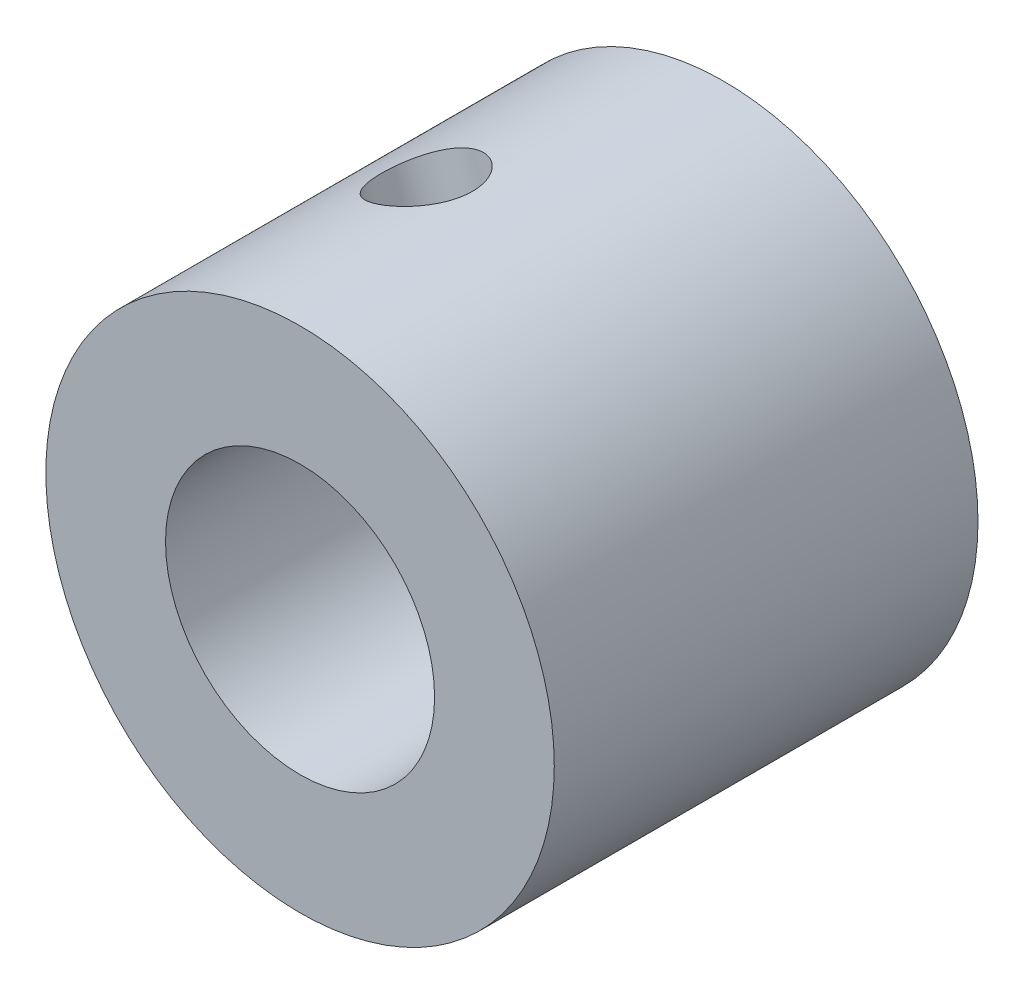
ISO-10303-21;
HEADER;
FILE_DESCRIPTION(('STEP AP214'),'2;1');
FILE_NAME('part.step','',(''),(''),'','','');
FILE_SCHEMA(('AUTOMOTIVE_DESIGN { 1 0 10303 214 1 1 1 1 }'));
ENDSEC;
DATA;
#1=APPLICATION_CONTEXT('core data for automotive mechanical design processes');
#2=APPLICATION_PROTOCOL_DEFINITION('international standard','automotive_design',2000,#1);
#3=PRODUCT_CONTEXT('',#1,'mechanical');
#4=PRODUCT('Part','Part','',(#3));
#5=PRODUCT_RELATED_PRODUCT_CATEGORY('part','',(#4));
#6=PRODUCT_DEFINITION_FORMATION('','',#4);
#7=PRODUCT_DEFINITION_CONTEXT('part definition',#1,'design');
#8=PRODUCT_DEFINITION('design','',#6,#7);
#9=PRODUCT_DEFINITION_SHAPE('','',#8);
#10=(LENGTH_UNIT() NAMED_UNIT(*) SI_UNIT(.MILLI.,.METRE.));
#11=(NAMED_UNIT(*) PLANE_ANGLE_UNIT() SI_UNIT($,.RADIAN.));
#12=(NAMED_UNIT(*) SI_UNIT($,.STERADIAN.) SOLID_ANGLE_UNIT());
#13=UNCERTAINTY_MEASURE_WITH_UNIT(LENGTH_MEASURE(1.E-05),#10,'distance_accuracy_value','');
#14=(GEOMETRIC_REPRESENTATION_CONTEXT(3) GLOBAL_UNCERTAINTY_ASSIGNED_CONTEXT((#13)) GLOBAL_UNIT_ASSIGNED_CONTEXT((#10,
#11,#12)) REPRESENTATION_CONTEXT('',''));
#15=CARTESIAN_POINT('',(0.,0.,0.));
#16=DIRECTION('',(0.,0.,1.));
#17=DIRECTION('',(1.,0.,0.));
#18=AXIS2_PLACEMENT_3D('',#15,#16,#17);
#19=CARTESIAN_POINT('',(0.,0.,10.));
#20=DIRECTION('',(0.,0.,1.));
#21=DIRECTION('',(1.,0.,0.));
#22=AXIS2_PLACEMENT_3D('',#19,#20,#21);
#23=PLANE('',#22);
#24=CARTESIAN_POINT('',(0.,0.,10.));
#25=DIRECTION('',(0.,0.,1.));
#26=DIRECTION('',(1.,0.,0.));
#27=AXIS2_PLACEMENT_3D('',#24,#25,#26);
#28=CIRCLE('',#27,6.);
#29=CARTESIAN_POINT('',(6.,0.,10.));
#30=VERTEX_POINT('',#29);
#31=EDGE_CURVE('E47',#30,#30,#28,.T.);
#32=ORIENTED_EDGE('',*,*,#31,.T.);
#33=EDGE_LOOP('',(#32));
#34=FACE_BOUND('',#33,.T.);
#35=CARTESIAN_POINT('',(0.,0.,10.));
#36=DIRECTION('',(0.,0.,1.));
#37=DIRECTION('',(1.,0.,0.));
#38=AXIS2_PLACEMENT_3D('',#35,#36,#37);
#39=CIRCLE('',#38,3.175);
#40=CARTESIAN_POINT('',(3.175,0.,10.));
#41=VERTEX_POINT('',#40);
#42=EDGE_CURVE('E56',#41,#41,#39,.T.);
#43=ORIENTED_EDGE('',*,*,#42,.F.);
#44=EDGE_LOOP('',(#43));
#45=FACE_BOUND('',#44,.T.);
#46=ADVANCED_FACE('F36',(#34,#45),#23,.T.);
#47=CARTESIAN_POINT('',(0.,0.,0.));
#48=DIRECTION('',(0.,0.,1.));
#49=DIRECTION('',(1.,0.,0.));
#50=AXIS2_PLACEMENT_3D('',#47,#48,#49);
#51=PLANE('',#50);
#52=CARTESIAN_POINT('',(0.,0.,0.));
#53=DIRECTION('',(0.,0.,1.));
#54=DIRECTION('',(1.,0.,0.));
#55=AXIS2_PLACEMENT_3D('',#52,#53,#54);
#56=CIRCLE('',#55,6.);
#57=CARTESIAN_POINT('',(6.,0.,0.));
#58=VERTEX_POINT('',#57);
#59=EDGE_CURVE('E51',#58,#58,#56,.T.);
#60=ORIENTED_EDGE('',*,*,#59,.F.);
#61=EDGE_LOOP('',(#60));
#62=FACE_BOUND('',#61,.T.);
#63=CARTESIAN_POINT('',(0.,0.,0.));
#64=DIRECTION('',(0.,0.,1.));
#65=DIRECTION('',(1.,0.,0.));
#66=AXIS2_PLACEMENT_3D('',#63,#64,#65);
#67=CIRCLE('',#66,3.175);
#68=CARTESIAN_POINT('',(3.175,0.,0.));
#69=VERTEX_POINT('',#68);
#70=EDGE_CURVE('E58',#69,#69,#67,.T.);
#71=ORIENTED_EDGE('',*,*,#70,.T.);
#72=EDGE_LOOP('',(#71));
#73=FACE_BOUND('',#72,.T.);
#74=ADVANCED_FACE('F82',(#62,#73),#51,.F.);
#75=CARTESIAN_POINT('',(0.,0.,10.));
#76=DIRECTION('',(0.,0.,-1.));
#77=DIRECTION('',(-1.,0.,0.));
#78=AXIS2_PLACEMENT_3D('',#75,#76,#77);
#79=CYLINDRICAL_SURFACE('',#78,6.);
#80=CARTESIAN_POINT('',(-2.90937930885415,5.24742908834521,5.17004521619187));
#81=CARTESIAN_POINT('',(-2.90937740223212,5.24743099708408,5.10716313939418));
#82=CARTESIAN_POINT('',(-2.90469282606548,5.25003589824677,5.04424990720161));
#83=CARTESIAN_POINT('',(-2.88606456780618,5.2602984845414,4.92019784248082));
#84=CARTESIAN_POINT('',(-2.87211306179035,5.2679604392295,4.85906055491759));
#85=CARTESIAN_POINT('',(-2.83531684969267,5.28785520007973,4.74037324169944));
#86=CARTESIAN_POINT('',(-2.81248046616209,5.30008372825862,4.68281991726653));
#87=CARTESIAN_POINT('',(-2.7584671716293,5.32839416926601,4.57281324494172));
#88=CARTESIAN_POINT('',(-2.72729089866323,5.34447578730733,4.52035950732863));
#89=CARTESIAN_POINT('',(-2.65692021024631,5.3798083767979,4.42137823572656));
#90=CARTESIAN_POINT('',(-2.61763948115923,5.39909298935484,4.37492406390095));
#91=CARTESIAN_POINT('',(-2.53219098909114,5.43969135803022,4.28989986023983));
#92=CARTESIAN_POINT('',(-2.4860227722531,5.46100524783614,4.25133034836821));
#93=CARTESIAN_POINT('',(-2.38751446673446,5.50478860764355,4.18288894930693));
#94=CARTESIAN_POINT('',(-2.33512962274242,5.52726570724702,4.15308626823184));
#95=CARTESIAN_POINT('',(-2.22581104738116,5.5721856397903,4.10347044162291));
#96=CARTESIAN_POINT('',(-2.16887769399804,5.59462847541984,4.08365646701486));
#97=CARTESIAN_POINT('',(-2.05269516747164,5.63828402086555,4.054807456249));
#98=CARTESIAN_POINT('',(-1.993480983613,5.65950807036627,4.0456487345637));
#99=CARTESIAN_POINT('',(-1.87379354993467,5.70025370893503,4.03798479160885));
#100=CARTESIAN_POINT('',(-1.81332040874296,5.71977544413771,4.03947865495836));
#101=CARTESIAN_POINT('',(-1.69365054830205,5.75633693249849,4.05298269057115));
#102=CARTESIAN_POINT('',(-1.63444735726852,5.7734049422337,4.06485968047972));
#103=CARTESIAN_POINT('',(-1.51825605851861,5.80504319094556,4.09858214434878));
#104=CARTESIAN_POINT('',(-1.46126803217375,5.81961333823303,4.12042798412862));
#105=CARTESIAN_POINT('',(-1.35084726107495,5.84623458294966,4.17359468148321));
#106=CARTESIAN_POINT('',(-1.297436573094,5.85827088664806,4.20496870549215));
#107=CARTESIAN_POINT('',(-1.1960842114209,5.87980195769522,4.2762619912473));
#108=CARTESIAN_POINT('',(-1.1481430997281,5.88929646400882,4.3161821298974));
#109=CARTESIAN_POINT('',(-1.05845879506584,5.90608011718007,4.40416813747097));
#110=CARTESIAN_POINT('',(-1.01682302206378,5.91333285379279,4.45235052546055));
#111=CARTESIAN_POINT('',(-0.941967114938653,5.92571867923697,4.55510535787081));
#112=CARTESIAN_POINT('',(-0.908747106272158,5.93085173647039,4.60967789753383));
#113=CARTESIAN_POINT('',(-0.851778526778022,5.93930199093268,4.72381515957614));
#114=CARTESIAN_POINT('',(-0.828046405404513,5.94261603816224,4.78338833728392));
#115=CARTESIAN_POINT('',(-0.790983046757102,5.9476633379282,4.90574949054541));
#116=CARTESIAN_POINT('',(-0.777650618951003,5.94939677141335,4.96853709724174));
#117=CARTESIAN_POINT('',(-0.762001183525699,5.95142136508584,5.09452170471922));
#118=CARTESIAN_POINT('',(-0.759519699099542,5.95173406341029,5.15769794943522));
#119=CARTESIAN_POINT('',(-0.765214190876867,5.95100455325656,5.28355770356006));
#120=CARTESIAN_POINT('',(-0.77338963476434,5.9499624124529,5.34624123742258));
#121=CARTESIAN_POINT('',(-0.799983122348805,5.94644453364008,5.46879949870044));
#122=CARTESIAN_POINT('',(-0.818315068615444,5.94398083906723,5.52869330948714));
#123=CARTESIAN_POINT('',(-0.864522302716196,5.93743567522528,5.64458347289417));
#124=CARTESIAN_POINT('',(-0.892398299691919,5.93335408573987,5.70057953553206));
#125=CARTESIAN_POINT('',(-0.957154127839459,5.92325402403024,5.80780245329278));
#126=CARTESIAN_POINT('',(-0.994135038010752,5.91721354819956,5.85896617068206));
#127=CARTESIAN_POINT('',(-1.07575824772212,5.90291935234871,5.954413903892));
#128=CARTESIAN_POINT('',(-1.12040124290962,5.89466543132959,5.9986972943456));
#129=CARTESIAN_POINT('',(-1.21664511522656,5.87556033652041,6.07973693215948));
#130=CARTESIAN_POINT('',(-1.2683317745134,5.8646756094868,6.1163835122474));
#131=CARTESIAN_POINT('',(-1.37661450587918,5.84020624277289,6.18033501304486));
#132=CARTESIAN_POINT('',(-1.43321038759574,5.82662170775529,6.20764029577423));
#133=CARTESIAN_POINT('',(-1.54928725018275,5.79683337132111,6.25197023352538));
#134=CARTESIAN_POINT('',(-1.60875135726321,5.78064382804465,6.26904858875984));
#135=CARTESIAN_POINT('',(-1.72904220579137,5.74580983869063,6.29261117356725));
#136=CARTESIAN_POINT('',(-1.78986880174824,5.72716565370008,6.29909652887838));
#137=CARTESIAN_POINT('',(-1.91012534277765,5.68817684067372,6.30124952190395));
#138=CARTESIAN_POINT('',(-1.96956234673546,5.66786293447405,6.29708274331441));
#139=CARTESIAN_POINT('',(-2.08631375635869,5.62593487832967,6.27841260639274));
#140=CARTESIAN_POINT('',(-2.143628182783,5.60432074110668,6.26390934917979));
#141=CARTESIAN_POINT('',(-2.25449361856928,5.56064789388123,6.22504798978098));
#142=CARTESIAN_POINT('',(-2.30805121503208,5.53859005394114,6.2007076695435));
#143=CARTESIAN_POINT('',(-2.41017737966411,5.49491885890945,6.1428830386148));
#144=CARTESIAN_POINT('',(-2.45874560905515,5.47330553408001,6.1093981075682));
#145=CARTESIAN_POINT('',(-2.55040538916106,5.43120760982855,6.03366559836118));
#146=CARTESIAN_POINT('',(-2.59340773242426,5.41074381512831,5.9912984729543));
#147=CARTESIAN_POINT('',(-2.67210489608654,5.37231589728247,5.89925211976381));
#148=CARTESIAN_POINT('',(-2.70779799472162,5.3543523634162,5.84957117386482));
#149=CARTESIAN_POINT('',(-2.77133207399547,5.32174869794727,5.74375134112198));
#150=CARTESIAN_POINT('',(-2.79909647840745,5.30714122712807,5.68755639075082));
#151=CARTESIAN_POINT('',(-2.84562338854613,5.2823411796218,5.57068663399221));
#152=CARTESIAN_POINT('',(-2.86439436899462,5.27214444747259,5.51001610752259));
#153=CARTESIAN_POINT('',(-2.88870659747289,5.25885032975111,5.40264862653763));
#154=CARTESIAN_POINT('',(-2.89644772246245,5.25458139250691,5.35657918732826));
#155=CARTESIAN_POINT('',(-2.90678471693756,5.24887010013723,5.26369398421176));
#156=CARTESIAN_POINT('',(-2.90938072885936,5.24742766676342,5.21687824100132));
#157=CARTESIAN_POINT('',(-2.90937930885415,5.24742908834521,5.17004521619187));
#158=B_SPLINE_CURVE_WITH_KNOTS('',3,(#80,#81,#82,#83,#84,#85,#86,#87,#88,#89,#90,#91,#92,#93,
#94,#95,#96,#97,#98,#99,#100,#101,#102,#103,#104,#105,#106,#107,#108,#109,#110,#111,#112,#113,
#114,#115,#116,#117,#118,#119,#120,#121,#122,#123,#124,#125,#126,#127,#128,#129,#130,#131,#132,
#133,#134,#135,#136,#137,#138,#139,#140,#141,#142,#143,#144,#145,#146,#147,#148,#149,#150,#151,
#152,#153,#154,#155,#156,#157),.UNSPECIFIED.,.T.,.F.,(4,2,2,2,2,2,2,2,2,2,2,2,2,2,2,2,2,2,2,2,2,
2,2,2,2,2,2,2,2,2,2,2,2,2,2,2,2,2,4),(0.,0.188474837809351,0.377109004567856,0.565566899632642,
0.754010381007903,0.944575275358038,1.1351527327001,1.3271965620485,1.5192244489112,
1.70900031705595,1.89875987787999,2.08612056256102,2.27348812322843,2.46192101060148,
2.6503732420629,2.84174242061811,3.03311445180864,3.22481684677291,3.41649729288065,
3.60526197869979,3.79401723604096,3.98119635589328,4.16838938653919,4.35776249296092,
4.54715280183705,4.73909944981967,4.93103865811115,5.12196097490292,5.31286300069766,
5.50081562562074,5.68876641187543,5.87637895810663,6.06400423482777,6.25433874077484,
6.44471803043099,6.6368782277284,6.82885698991454,6.96923230153582,7.1096037269816),.UNSPECIFIED.);
#159=CARTESIAN_POINT('',(-2.90937930885415,5.24742908834521,5.17004521619187));
#160=VERTEX_POINT('',#159);
#161=EDGE_CURVE('E10',#160,#160,#158,.T.);
#162=ORIENTED_EDGE('',*,*,#161,.T.);
#163=EDGE_LOOP('',(#162));
#164=FACE_BOUND('',#163,.T.);
#165=ORIENTED_EDGE('',*,*,#31,.F.);
#166=EDGE_LOOP('',(#165));
#167=FACE_BOUND('',#166,.T.);
#168=ORIENTED_EDGE('',*,*,#59,.T.);
#169=EDGE_LOOP('',(#168));
#170=FACE_BOUND('',#169,.T.);
#171=ADVANCED_FACE('F38',(#164,#167,#170),#79,.T.);
#172=CARTESIAN_POINT('',(0.,0.,10.));
#173=DIRECTION('',(0.,0.,-1.));
#174=DIRECTION('',(-1.,0.,0.));
#175=AXIS2_PLACEMENT_3D('',#172,#173,#174);
#176=CYLINDRICAL_SURFACE('',#175,3.175);
#177=CARTESIAN_POINT('',(-1.99817781419328,2.46736912983562,5.17004521619187));
#178=CARTESIAN_POINT('',(-1.99817867605391,2.46736768340754,5.10875625685335));
#179=CARTESIAN_POINT('',(-1.99402284213028,2.470751223864,5.04747608884612));
#180=CARTESIAN_POINT('',(-1.97752165152481,2.48397726063375,4.92674845427017));
#181=CARTESIAN_POINT('',(-1.96517584672942,2.49382011036726,4.8673010881693));
#182=CARTESIAN_POINT('',(-1.93264604881708,2.51911161588565,4.75201146370976));
#183=CARTESIAN_POINT('',(-1.91247919822774,2.53454800666626,4.69616163017329));
#184=CARTESIAN_POINT('',(-1.86472321895702,2.56988554652441,4.58925596656392));
#185=CARTESIAN_POINT('',(-1.83713211692841,2.58978788240495,4.53820141593934));
#186=CARTESIAN_POINT('',(-1.77372576856669,2.633640820077,4.44005300933524));
#187=CARTESIAN_POINT('',(-1.73762194579172,2.65772303875551,4.39320432557603));
#188=CARTESIAN_POINT('',(-1.65845474322389,2.70783034569913,4.3070130728289));
#189=CARTESIAN_POINT('',(-1.61539006253945,2.73385579663833,4.26767190989922));
#190=CARTESIAN_POINT('',(-1.52161718538534,2.78716655630376,4.19646393619597));
#191=CARTESIAN_POINT('',(-1.47071723916458,2.8144661645404,4.16485910738971));
#192=CARTESIAN_POINT('',(-1.36337823354975,2.86799834100779,4.11176465689786));
#193=CARTESIAN_POINT('',(-1.30694089869699,2.89423123787337,4.0902718979598));
#194=CARTESIAN_POINT('',(-1.19230479669044,2.94325771095632,4.05885811631053));
#195=CARTESIAN_POINT('',(-1.13426212697592,2.96614587065331,4.04851598838143));
#196=CARTESIAN_POINT('',(-1.0161080797782,3.00866860148792,4.03835260980519));
#197=CARTESIAN_POINT('',(-0.955997314192231,3.02830412516854,4.03852827351369));
#198=CARTESIAN_POINT('',(-0.838294621022832,3.06292102585541,4.04913995873195));
#199=CARTESIAN_POINT('',(-0.780710084168592,3.07807108369506,4.0591174377241));
#200=CARTESIAN_POINT('',(-0.667049361626726,3.10468660100746,4.08828433916613));
#201=CARTESIAN_POINT('',(-0.610973281429885,3.11615180339814,4.10747440411957));
#202=CARTESIAN_POINT('',(-0.501139446601083,3.13570439803023,4.15475980519838));
#203=CARTESIAN_POINT('',(-0.447425081674208,3.1437423087068,4.18297592952737));
#204=CARTESIAN_POINT('',(-0.344612550552026,3.15666850264726,4.24740930243634));
#205=CARTESIAN_POINT('',(-0.295515791894326,3.16155582819111,4.28362897946091));
#206=CARTESIAN_POINT('',(-0.200794939648785,3.16901933484475,4.36529910225846));
#207=CARTESIAN_POINT('',(-0.155494637145851,3.17145870156814,4.41113816999932));
#208=CARTESIAN_POINT('',(-0.0728839020604865,3.17443313840523,4.5095978374634));
#209=CARTESIAN_POINT('',(-0.0355750881349026,3.1749678230723,4.56221980759648));
#210=CARTESIAN_POINT('',(0.030305064114658,3.17503003023238,4.67400448634141));
#211=CARTESIAN_POINT('',(0.0587044091413558,3.17453898293312,4.73326908651544));
#212=CARTESIAN_POINT('',(0.104530605415151,3.173362586877,4.8558931622208));
#213=CARTESIAN_POINT('',(0.121962843348918,3.17267733374802,4.91925061058925));
#214=CARTESIAN_POINT('',(0.144365353607663,3.17173513228354,5.04483017758253));
#215=CARTESIAN_POINT('',(0.149921411686682,3.17145827148492,5.10694760338808));
#216=CARTESIAN_POINT('',(0.150034147329873,3.1714532573148,5.23118493032867));
#217=CARTESIAN_POINT('',(0.144593201506296,3.17172498538527,5.29330482802821));
#218=CARTESIAN_POINT('',(0.123453257418565,3.17261514549937,5.41311485313931));
#219=CARTESIAN_POINT('',(0.108184977692267,3.17321887170373,5.47088211550303));
#220=CARTESIAN_POINT('',(0.068489824028127,3.17432285858165,5.58317478147241));
#221=CARTESIAN_POINT('',(0.0440611884770932,3.17482309932535,5.6376995591829));
#222=CARTESIAN_POINT('',(-0.0140229743624681,3.17510591335274,5.74407391697074));
#223=CARTESIAN_POINT('',(-0.0479709845867883,3.17486280885586,5.79576353239109));
#224=CARTESIAN_POINT('',(-0.12352364084153,3.17282098856276,5.89318037510574));
#225=CARTESIAN_POINT('',(-0.165130840909579,3.17102175311591,5.93890560479678));
#226=CARTESIAN_POINT('',(-0.257296524800867,3.16491235508622,6.0257520425013));
#227=CARTESIAN_POINT('',(-0.308226206145388,3.16046700440893,6.06647111004499));
#228=CARTESIAN_POINT('',(-0.415706140484605,3.14813204433136,6.13901546998767));
#229=CARTESIAN_POINT('',(-0.472256293345815,3.1402424962839,6.17084092079551));
#230=CARTESIAN_POINT('',(-0.588938852991711,3.12045754439254,6.22443825356253));
#231=CARTESIAN_POINT('',(-0.649051023691532,3.10858326199621,6.24626173821565));
#232=CARTESIAN_POINT('',(-0.771166664517458,3.08055898270429,6.2792617869657));
#233=CARTESIAN_POINT('',(-0.83316933269631,3.06441077707684,6.29044280248542));
#234=CARTESIAN_POINT('',(-0.953690615451909,3.02899901558146,6.30139684299701));
#235=CARTESIAN_POINT('',(-1.01221951642546,3.00994625045796,6.30174375489409));
#236=CARTESIAN_POINT('',(-1.12735781084508,2.96874163744067,6.29246754382231));
#237=CARTESIAN_POINT('',(-1.18396739798168,2.9465901034274,6.28284543000449));
#238=CARTESIAN_POINT('',(-1.2926019297436,2.90055498042532,6.2542985393121));
#239=CARTESIAN_POINT('',(-1.34469640983921,2.87671544587254,6.23556570651531));
#240=CARTESIAN_POINT('',(-1.44439342813549,2.82797366724628,6.18951346948072));
#241=CARTESIAN_POINT('',(-1.4919951233978,2.80307122501735,6.16219245807248));
#242=CARTESIAN_POINT('',(-1.58361614722359,2.7523873211812,6.09849165044076));
#243=CARTESIAN_POINT('',(-1.62741668005118,2.72661044319016,6.0617938323411));
#244=CARTESIAN_POINT('',(-1.70848145365538,2.6765630358283,5.98090046892744));
#245=CARTESIAN_POINT('',(-1.74574345857571,2.65229302355778,5.93670236900763));
#246=CARTESIAN_POINT('',(-1.81471041096759,2.60562215569306,5.83962250223903));
#247=CARTESIAN_POINT('',(-1.84607803171595,2.58335994108655,5.78643334875031));
#248=CARTESIAN_POINT('',(-1.9004286672549,2.54364576925812,5.67427506401169));
#249=CARTESIAN_POINT('',(-1.92341233278963,2.52619343872931,5.61530638180702));
#250=CARTESIAN_POINT('',(-1.96050376696665,2.49751990393777,5.49306885843925));
#251=CARTESIAN_POINT('',(-1.9745965824605,2.48630920090685,5.42979297008482));
#252=CARTESIAN_POINT('',(-1.99343084020093,2.47123639824484,5.30102237442448));
#253=CARTESIAN_POINT('',(-1.99817689334711,2.4673706752569,5.2355287773766));
#254=CARTESIAN_POINT('',(-1.99817781419328,2.46736912983562,5.17004521619187));
#255=B_SPLINE_CURVE_WITH_KNOTS('',3,(#177,#178,#179,#180,#181,#182,#183,#184,#185,#186,#187,
#188,#189,#190,#191,#192,#193,#194,#195,#196,#197,#198,#199,#200,#201,#202,#203,#204,#205,#206,
#207,#208,#209,#210,#211,#212,#213,#214,#215,#216,#217,#218,#219,#220,#221,#222,#223,#224,#225,
#226,#227,#228,#229,#230,#231,#232,#233,#234,#235,#236,#237,#238,#239,#240,#241,#242,#243,#244,
#245,#246,#247,#248,#249,#250,#251,#252,#253,#254),.UNSPECIFIED.,.T.,.F.,(4,2,2,2,2,2,2,2,2,2,2,
2,2,2,2,2,2,2,2,2,2,2,2,2,2,2,2,2,2,2,2,2,2,2,2,2,2,2,4),(0.,0.183623661784849,
0.367257371351086,0.550490838429559,0.733773056690743,0.924501319590957,1.11526526836209,
1.3117975652931,1.50826884814032,1.69702812609223,1.88573202729146,2.06600906280415,
2.24629867301316,2.42910965891792,2.61197618983503,2.80457310610201,2.99720899560136,
3.19336255385327,3.38941969247877,3.57555921531926,3.76165851500699,3.94011049494313,
4.11859681030486,4.30331748902536,4.48809987675375,4.68324756844094,4.87839178402887,
5.07251754238689,5.26656206808729,5.45030949868024,5.63403833058546,5.81405386702816,
5.99410311120743,6.18133819670186,6.36863718318312,6.56461137244542,6.76057034738462,
6.9568580250145,7.15304884667685),.UNSPECIFIED.);
#256=CARTESIAN_POINT('',(-1.99817781419328,2.46736912983562,5.17004521619187));
#257=VERTEX_POINT('',#256);
#258=EDGE_CURVE('E61',#257,#257,#255,.T.);
#259=ORIENTED_EDGE('',*,*,#258,.F.);
#260=EDGE_LOOP('',(#259));
#261=FACE_BOUND('',#260,.T.);
#262=ORIENTED_EDGE('',*,*,#42,.T.);
#263=EDGE_LOOP('',(#262));
#264=FACE_BOUND('',#263,.T.);
#265=ORIENTED_EDGE('',*,*,#70,.F.);
#266=EDGE_LOOP('',(#265));
#267=FACE_BOUND('',#266,.T.);
#268=ADVANCED_FACE('F68',(#261,#264,#267),#176,.F.);
#269=CARTESIAN_POINT('',(-1.86876036403672,5.70155546336308,5.17004521619187));
#270=DIRECTION('',(-0.311460060672787,0.950259243893846,0.));
#271=DIRECTION('',(-0.950259243893846,-0.311460060672787,0.));
#272=AXIS2_PLACEMENT_3D('',#269,#270,#271);
#273=CYLINDRICAL_SURFACE('',#272,1.1303);
#274=ORIENTED_EDGE('',*,*,#258,.T.);
#275=EDGE_LOOP('',(#274));
#276=FACE_BOUND('',#275,.T.);
#277=ORIENTED_EDGE('',*,*,#161,.F.);
#278=EDGE_LOOP('',(#277));
#279=FACE_BOUND('',#278,.T.);
#280=ADVANCED_FACE('F71',(#276,#279),#273,.F.);
#281=CLOSED_SHELL('',(#46,#74,#171,#268,#280));
#282=MANIFOLD_SOLID_BREP('B2',#281);
#283=ADVANCED_BREP_SHAPE_REPRESENTATION('',(#18,#282),#14);
#284=SHAPE_DEFINITION_REPRESENTATION(#9,#283);
ENDSEC;
END-ISO-10303-21;
